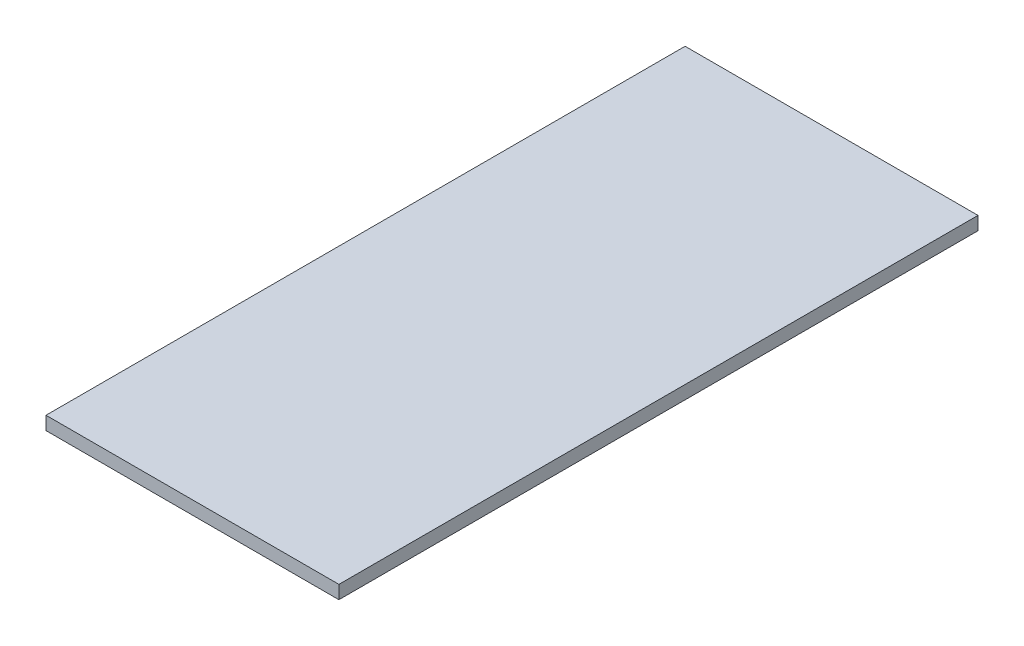
ISO-10303-21;
HEADER;
FILE_DESCRIPTION(('STEP AP214'),'2;1');
FILE_NAME('part.step','',(''),(''),'','','');
FILE_SCHEMA(('AUTOMOTIVE_DESIGN { 1 0 10303 214 1 1 1 1 }'));
ENDSEC;
DATA;
#1=APPLICATION_CONTEXT('core data for automotive mechanical design processes');
#2=APPLICATION_PROTOCOL_DEFINITION('international standard','automotive_design',2000,#1);
#3=PRODUCT_CONTEXT('',#1,'mechanical');
#4=PRODUCT('Part','Part','',(#3));
#5=PRODUCT_RELATED_PRODUCT_CATEGORY('part','',(#4));
#6=PRODUCT_DEFINITION_FORMATION('','',#4);
#7=PRODUCT_DEFINITION_CONTEXT('part definition',#1,'design');
#8=PRODUCT_DEFINITION('design','',#6,#7);
#9=PRODUCT_DEFINITION_SHAPE('','',#8);
#10=(LENGTH_UNIT() NAMED_UNIT(*) SI_UNIT(.MILLI.,.METRE.));
#11=(NAMED_UNIT(*) PLANE_ANGLE_UNIT() SI_UNIT($,.RADIAN.));
#12=(NAMED_UNIT(*) SI_UNIT($,.STERADIAN.) SOLID_ANGLE_UNIT());
#13=UNCERTAINTY_MEASURE_WITH_UNIT(LENGTH_MEASURE(1.E-05),#10,'distance_accuracy_value','');
#14=(GEOMETRIC_REPRESENTATION_CONTEXT(3) GLOBAL_UNCERTAINTY_ASSIGNED_CONTEXT((#13)) GLOBAL_UNIT_ASSIGNED_CONTEXT((#10,
#11,#12)) REPRESENTATION_CONTEXT('',''));
#15=CARTESIAN_POINT('',(0.,0.,0.));
#16=DIRECTION('',(0.,0.,1.));
#17=DIRECTION('',(1.,0.,0.));
#18=AXIS2_PLACEMENT_3D('',#15,#16,#17);
#19=CARTESIAN_POINT('',(0.,3.175,0.));
#20=DIRECTION('',(-1.,0.,0.));
#21=DIRECTION('',(0.,0.,1.));
#22=AXIS2_PLACEMENT_3D('',#19,#20,#21);
#23=PLANE('',#22);
#24=DIRECTION('',(0.,0.,-1.));
#25=VECTOR('',#24,1.);
#26=CARTESIAN_POINT('',(0.,0.,0.));
#27=LINE('',#26,#25);
#28=CARTESIAN_POINT('',(0.,0.,0.));
#29=VERTEX_POINT('',#28);
#30=CARTESIAN_POINT('',(0.,0.,-152.4));
#31=VERTEX_POINT('',#30);
#32=EDGE_CURVE('E111',#29,#31,#27,.T.);
#33=ORIENTED_EDGE('',*,*,#32,.T.);
#34=DIRECTION('',(0.,-1.,0.));
#35=VECTOR('',#34,1.);
#36=CARTESIAN_POINT('',(0.,3.175,-152.4));
#37=LINE('',#36,#35);
#38=CARTESIAN_POINT('',(0.,3.175,-152.4));
#39=VERTEX_POINT('',#38);
#40=EDGE_CURVE('E11',#39,#31,#37,.T.);
#41=ORIENTED_EDGE('',*,*,#40,.F.);
#42=DIRECTION('',(0.,0.,-1.));
#43=VECTOR('',#42,1.);
#44=CARTESIAN_POINT('',(0.,3.175,0.));
#45=LINE('',#44,#43);
#46=CARTESIAN_POINT('',(0.,3.175,0.));
#47=VERTEX_POINT('',#46);
#48=EDGE_CURVE('E95',#47,#39,#45,.T.);
#49=ORIENTED_EDGE('',*,*,#48,.F.);
#50=DIRECTION('',(0.,-1.,0.));
#51=VECTOR('',#50,1.);
#52=CARTESIAN_POINT('',(0.,3.175,0.));
#53=LINE('',#52,#51);
#54=EDGE_CURVE('E107',#47,#29,#53,.T.);
#55=ORIENTED_EDGE('',*,*,#54,.T.);
#56=EDGE_LOOP('',(#33,#41,#49,#55));
#57=FACE_BOUND('',#56,.T.);
#58=ADVANCED_FACE('F43',(#57),#23,.F.);
#59=CARTESIAN_POINT('',(0.,3.175,-152.4));
#60=DIRECTION('',(0.,0.,1.));
#61=DIRECTION('',(1.,0.,0.));
#62=AXIS2_PLACEMENT_3D('',#59,#60,#61);
#63=PLANE('',#62);
#64=DIRECTION('',(-1.,0.,0.));
#65=VECTOR('',#64,1.);
#66=CARTESIAN_POINT('',(0.,0.,-152.4));
#67=LINE('',#66,#65);
#68=CARTESIAN_POINT('',(-69.85,0.,-152.4));
#69=VERTEX_POINT('',#68);
#70=EDGE_CURVE('E100',#31,#69,#67,.T.);
#71=ORIENTED_EDGE('',*,*,#70,.T.);
#72=DIRECTION('',(0.,-1.,0.));
#73=VECTOR('',#72,1.);
#74=CARTESIAN_POINT('',(-69.85,3.175,-152.4));
#75=LINE('',#74,#73);
#76=CARTESIAN_POINT('',(-69.85,3.175,-152.4));
#77=VERTEX_POINT('',#76);
#78=EDGE_CURVE('E52',#77,#69,#75,.T.);
#79=ORIENTED_EDGE('',*,*,#78,.F.);
#80=DIRECTION('',(-1.,0.,0.));
#81=VECTOR('',#80,1.);
#82=CARTESIAN_POINT('',(0.,3.175,-152.4));
#83=LINE('',#82,#81);
#84=EDGE_CURVE('E90',#39,#77,#83,.T.);
#85=ORIENTED_EDGE('',*,*,#84,.F.);
#86=ORIENTED_EDGE('',*,*,#40,.T.);
#87=EDGE_LOOP('',(#71,#79,#85,#86));
#88=FACE_BOUND('',#87,.T.);
#89=ADVANCED_FACE('F99',(#88),#63,.F.);
#90=CARTESIAN_POINT('',(-69.85,3.175,0.));
#91=DIRECTION('',(1.,0.,0.));
#92=DIRECTION('',(0.,0.,-1.));
#93=AXIS2_PLACEMENT_3D('',#90,#91,#92);
#94=PLANE('',#93);
#95=DIRECTION('',(0.,0.,1.));
#96=VECTOR('',#95,1.);
#97=CARTESIAN_POINT('',(-69.85,0.,0.));
#98=LINE('',#97,#96);
#99=CARTESIAN_POINT('',(-69.85,0.,0.));
#100=VERTEX_POINT('',#99);
#101=EDGE_CURVE('E77',#69,#100,#98,.T.);
#102=ORIENTED_EDGE('',*,*,#101,.T.);
#103=DIRECTION('',(0.,-1.,0.));
#104=VECTOR('',#103,1.);
#105=CARTESIAN_POINT('',(-69.85,3.175,0.));
#106=LINE('',#105,#104);
#107=CARTESIAN_POINT('',(-69.85,3.175,0.));
#108=VERTEX_POINT('',#107);
#109=EDGE_CURVE('E102',#108,#100,#106,.T.);
#110=ORIENTED_EDGE('',*,*,#109,.F.);
#111=DIRECTION('',(0.,0.,1.));
#112=VECTOR('',#111,1.);
#113=CARTESIAN_POINT('',(-69.85,3.175,0.));
#114=LINE('',#113,#112);
#115=EDGE_CURVE('E93',#77,#108,#114,.T.);
#116=ORIENTED_EDGE('',*,*,#115,.F.);
#117=ORIENTED_EDGE('',*,*,#78,.T.);
#118=EDGE_LOOP('',(#102,#110,#116,#117));
#119=FACE_BOUND('',#118,.T.);
#120=ADVANCED_FACE('F103',(#119),#94,.F.);
#121=CARTESIAN_POINT('',(0.,3.175,0.));
#122=DIRECTION('',(0.,0.,-1.));
#123=DIRECTION('',(-1.,0.,0.));
#124=AXIS2_PLACEMENT_3D('',#121,#122,#123);
#125=PLANE('',#124);
#126=DIRECTION('',(1.,0.,0.));
#127=VECTOR('',#126,1.);
#128=CARTESIAN_POINT('',(0.,0.,0.));
#129=LINE('',#128,#127);
#130=EDGE_CURVE('E83',#100,#29,#129,.T.);
#131=ORIENTED_EDGE('',*,*,#130,.T.);
#132=ORIENTED_EDGE('',*,*,#54,.F.);
#133=DIRECTION('',(1.,0.,0.));
#134=VECTOR('',#133,1.);
#135=CARTESIAN_POINT('',(0.,3.175,0.));
#136=LINE('',#135,#134);
#137=EDGE_CURVE('E60',#108,#47,#136,.T.);
#138=ORIENTED_EDGE('',*,*,#137,.F.);
#139=ORIENTED_EDGE('',*,*,#109,.T.);
#140=EDGE_LOOP('',(#131,#132,#138,#139));
#141=FACE_BOUND('',#140,.T.);
#142=ADVANCED_FACE('F124',(#141),#125,.F.);
#143=CARTESIAN_POINT('',(0.,3.175,0.));
#144=DIRECTION('',(0.,1.,0.));
#145=DIRECTION('',(0.,0.,1.));
#146=AXIS2_PLACEMENT_3D('',#143,#144,#145);
#147=PLANE('',#146);
#148=ORIENTED_EDGE('',*,*,#48,.T.);
#149=ORIENTED_EDGE('',*,*,#84,.T.);
#150=ORIENTED_EDGE('',*,*,#115,.T.);
#151=ORIENTED_EDGE('',*,*,#137,.T.);
#152=EDGE_LOOP('',(#148,#149,#150,#151));
#153=FACE_BOUND('',#152,.T.);
#154=ADVANCED_FACE('F91',(#153),#147,.T.);
#155=CARTESIAN_POINT('',(0.,0.,0.));
#156=DIRECTION('',(0.,1.,0.));
#157=DIRECTION('',(0.,0.,1.));
#158=AXIS2_PLACEMENT_3D('',#155,#156,#157);
#159=PLANE('',#158);
#160=ORIENTED_EDGE('',*,*,#32,.F.);
#161=ORIENTED_EDGE('',*,*,#130,.F.);
#162=ORIENTED_EDGE('',*,*,#101,.F.);
#163=ORIENTED_EDGE('',*,*,#70,.F.);
#164=EDGE_LOOP('',(#160,#161,#162,#163));
#165=FACE_BOUND('',#164,.T.);
#166=ADVANCED_FACE('F127',(#165),#159,.F.);
#167=CLOSED_SHELL('',(#58,#89,#120,#142,#154,#166));
#168=MANIFOLD_SOLID_BREP('B2',#167);
#169=ADVANCED_BREP_SHAPE_REPRESENTATION('',(#18,#168),#14);
#170=SHAPE_DEFINITION_REPRESENTATION(#9,#169);
ENDSEC;
END-ISO-10303-21;
